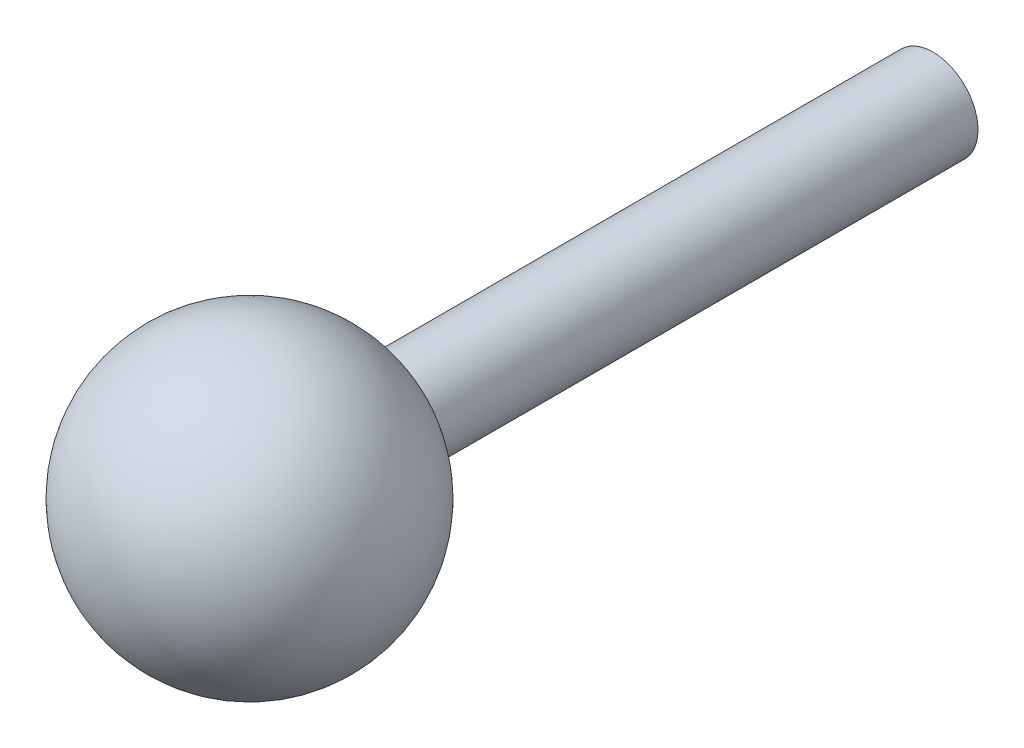
ISO-10303-21;
HEADER;
FILE_DESCRIPTION(('STEP AP214'),'2;1');
FILE_NAME('part.step','',(''),(''),'','','');
FILE_SCHEMA(('AUTOMOTIVE_DESIGN { 1 0 10303 214 1 1 1 1 }'));
ENDSEC;
DATA;
#1=APPLICATION_CONTEXT('core data for automotive mechanical design processes');
#2=APPLICATION_PROTOCOL_DEFINITION('international standard','automotive_design',2000,#1);
#3=PRODUCT_CONTEXT('',#1,'mechanical');
#4=PRODUCT('Part','Part','',(#3));
#5=PRODUCT_RELATED_PRODUCT_CATEGORY('part','',(#4));
#6=PRODUCT_DEFINITION_FORMATION('','',#4);
#7=PRODUCT_DEFINITION_CONTEXT('part definition',#1,'design');
#8=PRODUCT_DEFINITION('design','',#6,#7);
#9=PRODUCT_DEFINITION_SHAPE('','',#8);
#10=(LENGTH_UNIT() NAMED_UNIT(*) SI_UNIT(.MILLI.,.METRE.));
#11=(NAMED_UNIT(*) PLANE_ANGLE_UNIT() SI_UNIT($,.RADIAN.));
#12=(NAMED_UNIT(*) SI_UNIT($,.STERADIAN.) SOLID_ANGLE_UNIT());
#13=UNCERTAINTY_MEASURE_WITH_UNIT(LENGTH_MEASURE(1.E-05),#10,'distance_accuracy_value','');
#14=(GEOMETRIC_REPRESENTATION_CONTEXT(3) GLOBAL_UNCERTAINTY_ASSIGNED_CONTEXT((#13)) GLOBAL_UNIT_ASSIGNED_CONTEXT((#10,
#11,#12)) REPRESENTATION_CONTEXT('',''));
#15=CARTESIAN_POINT('',(0.,0.,0.));
#16=DIRECTION('',(0.,0.,1.));
#17=DIRECTION('',(1.,0.,0.));
#18=AXIS2_PLACEMENT_3D('',#15,#16,#17);
#19=CARTESIAN_POINT('',(0.,0.,19.));
#20=DIRECTION('',(0.,0.,-1.));
#21=DIRECTION('',(-1.,0.,0.));
#22=AXIS2_PLACEMENT_3D('',#19,#20,#21);
#23=CYLINDRICAL_SURFACE('',#22,1.25);
#24=CARTESIAN_POINT('',(0.,0.,0.));
#25=DIRECTION('',(0.,0.,1.));
#26=DIRECTION('',(1.,0.,0.));
#27=AXIS2_PLACEMENT_3D('',#24,#25,#26);
#28=CIRCLE('',#27,1.25);
#29=CARTESIAN_POINT('',(1.25,0.,0.));
#30=VERTEX_POINT('',#29);
#31=EDGE_CURVE('E46',#30,#30,#28,.T.);
#32=ORIENTED_EDGE('',*,*,#31,.T.);
#33=EDGE_LOOP('',(#32));
#34=FACE_BOUND('',#33,.T.);
#35=CARTESIAN_POINT('',(0.,0.,15.2003289616073));
#36=DIRECTION('',(0.,0.,1.));
#37=DIRECTION('',(1.,0.,0.));
#38=AXIS2_PLACEMENT_3D('',#35,#36,#37);
#39=CIRCLE('',#38,1.25);
#40=CARTESIAN_POINT('',(1.25,0.,15.2003289616073));
#41=VERTEX_POINT('',#40);
#42=EDGE_CURVE('E10',#41,#41,#39,.T.);
#43=ORIENTED_EDGE('',*,*,#42,.F.);
#44=EDGE_LOOP('',(#43));
#45=FACE_BOUND('',#44,.T.);
#46=ADVANCED_FACE('F38',(#34,#45),#23,.T.);
#47=CARTESIAN_POINT('',(0.,0.,0.));
#48=DIRECTION('',(0.,0.,1.));
#49=DIRECTION('',(1.,0.,0.));
#50=AXIS2_PLACEMENT_3D('',#47,#48,#49);
#51=PLANE('',#50);
#52=ORIENTED_EDGE('',*,*,#31,.F.);
#53=EDGE_LOOP('',(#52));
#54=FACE_BOUND('',#53,.T.);
#55=ADVANCED_FACE('F70',(#54),#51,.F.);
#56=CARTESIAN_POINT('',(0.,0.,19.));
#57=DIRECTION('',(0.,-1.,0.));
#58=DIRECTION('',(1.,0.,0.));
#59=AXIS2_PLACEMENT_3D('',#56,#57,#58);
#60=SPHERICAL_SURFACE('',#59,4.);
#61=CARTESIAN_POINT('',(0.,0.,19.));
#62=DIRECTION('',(0.,0.,1.));
#63=DIRECTION('',(1.,0.,0.));
#64=AXIS2_PLACEMENT_3D('',#61,#62,#63);
#65=SPHERICAL_SURFACE('',#64,4.);
#66=ORIENTED_EDGE('',*,*,#42,.T.);
#67=EDGE_LOOP('',(#66));
#68=FACE_BOUND('',#67,.T.);
#69=ADVANCED_FACE('F69',(#68),#65,.T.);
#70=CLOSED_SHELL('',(#46,#55,#69));
#71=CARTESIAN_POINT('',(0.,0.,19.));
#72=DIRECTION('',(0.,-1.,0.));
#73=DIRECTION('',(1.,0.,0.));
#74=AXIS2_PLACEMENT_3D('',#71,#72,#73);
#75=SPHERICAL_SURFACE('',#74,1.25);
#76=CARTESIAN_POINT('',(0.,0.,19.));
#77=DIRECTION('',(0.,0.,1.));
#78=DIRECTION('',(1.,0.,0.));
#79=AXIS2_PLACEMENT_3D('',#76,#77,#78);
#80=SPHERICAL_SURFACE('',#79,1.25);
#81=CARTESIAN_POINT('',(0.,0.,19.));
#82=DIRECTION('',(0.,0.,1.));
#83=DIRECTION('',(1.,0.,0.));
#84=AXIS2_PLACEMENT_3D('',#81,#82,#83);
#85=CIRCLE('',#84,1.25);
#86=CARTESIAN_POINT('',(1.25,0.,19.));
#87=VERTEX_POINT('',#86);
#88=EDGE_CURVE('E51',#87,#87,#85,.F.);
#89=ORIENTED_EDGE('',*,*,#88,.T.);
#90=EDGE_LOOP('',(#89));
#91=FACE_BOUND('',#90,.T.);
#92=ADVANCED_FACE('F58',(#91),#80,.F.);
#93=CARTESIAN_POINT('',(0.,0.,19.));
#94=DIRECTION('',(0.,0.,1.));
#95=DIRECTION('',(1.,0.,0.));
#96=AXIS2_PLACEMENT_3D('',#93,#94,#95);
#97=PLANE('',#96);
#98=ORIENTED_EDGE('',*,*,#88,.F.);
#99=EDGE_LOOP('',(#98));
#100=FACE_BOUND('',#99,.T.);
#101=ADVANCED_FACE('F60',(#100),#97,.T.);
#102=CLOSED_SHELL('',(#92,#101));
#103=ORIENTED_CLOSED_SHELL('',*,#102,.T.);
#104=BREP_WITH_VOIDS('B2',#70,(#103));
#105=ADVANCED_BREP_SHAPE_REPRESENTATION('',(#18,#104),#14);
#106=SHAPE_DEFINITION_REPRESENTATION(#9,#105);
ENDSEC;
END-ISO-10303-21;
